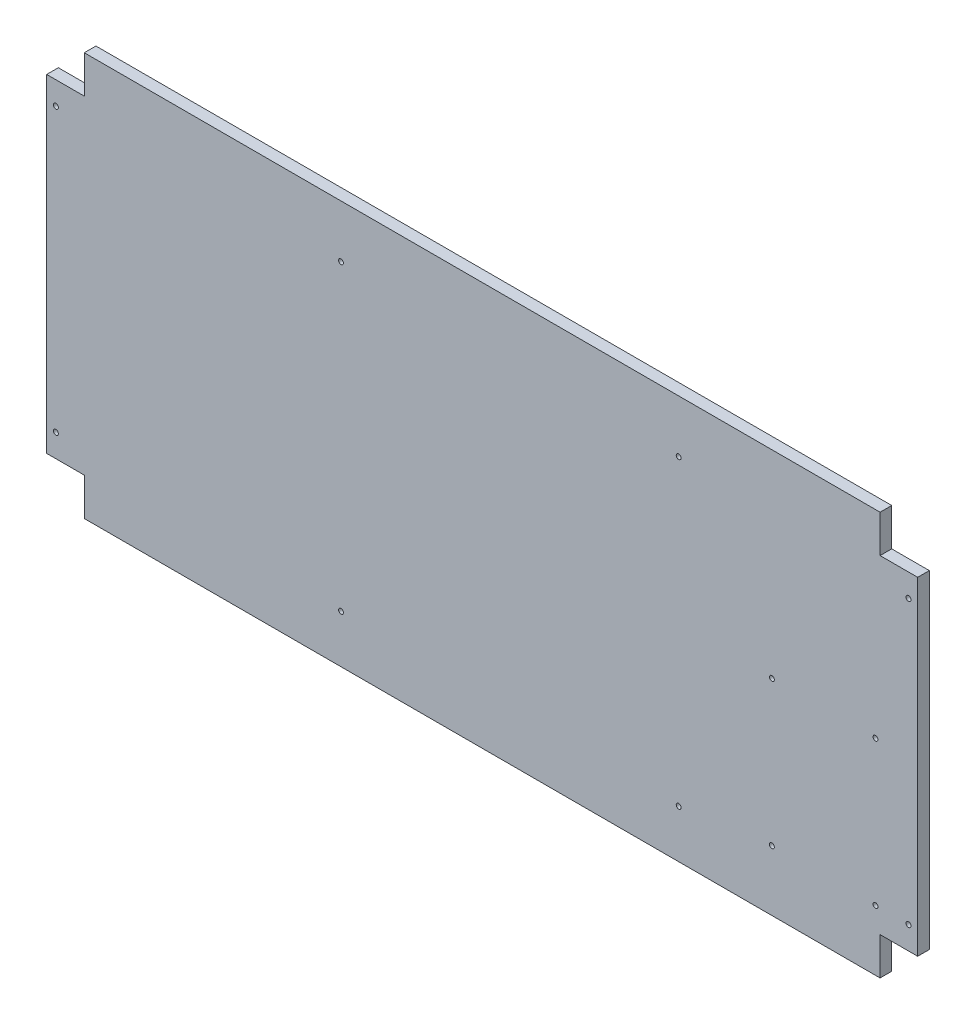
ISO-10303-21;
HEADER;
FILE_DESCRIPTION(('STEP AP214'),'2;1');
FILE_NAME('part.step','',(''),(''),'','','');
FILE_SCHEMA(('AUTOMOTIVE_DESIGN { 1 0 10303 214 1 1 1 1 }'));
ENDSEC;
DATA;
#1=APPLICATION_CONTEXT('core data for automotive mechanical design processes');
#2=APPLICATION_PROTOCOL_DEFINITION('international standard','automotive_design',2000,#1);
#3=PRODUCT_CONTEXT('',#1,'mechanical');
#4=PRODUCT('Part','Part','',(#3));
#5=PRODUCT_RELATED_PRODUCT_CATEGORY('part','',(#4));
#6=PRODUCT_DEFINITION_FORMATION('','',#4);
#7=PRODUCT_DEFINITION_CONTEXT('part definition',#1,'design');
#8=PRODUCT_DEFINITION('design','',#6,#7);
#9=PRODUCT_DEFINITION_SHAPE('','',#8);
#10=(LENGTH_UNIT() NAMED_UNIT(*) SI_UNIT(.MILLI.,.METRE.));
#11=(NAMED_UNIT(*) PLANE_ANGLE_UNIT() SI_UNIT($,.RADIAN.));
#12=(NAMED_UNIT(*) SI_UNIT($,.STERADIAN.) SOLID_ANGLE_UNIT());
#13=UNCERTAINTY_MEASURE_WITH_UNIT(LENGTH_MEASURE(1.E-05),#10,'distance_accuracy_value','');
#14=(GEOMETRIC_REPRESENTATION_CONTEXT(3) GLOBAL_UNCERTAINTY_ASSIGNED_CONTEXT((#13)) GLOBAL_UNIT_ASSIGNED_CONTEXT((#10,
#11,#12)) REPRESENTATION_CONTEXT('',''));
#15=CARTESIAN_POINT('',(0.,0.,0.));
#16=DIRECTION('',(0.,0.,1.));
#17=DIRECTION('',(1.,0.,0.));
#18=AXIS2_PLACEMENT_3D('',#15,#16,#17);
#19=CARTESIAN_POINT('',(475.,-220.,12.7));
#20=DIRECTION('',(-1.,0.,0.));
#21=DIRECTION('',(0.,0.,1.));
#22=AXIS2_PLACEMENT_3D('',#19,#20,#21);
#23=PLANE('',#22);
#24=DIRECTION('',(0.,1.,0.));
#25=VECTOR('',#24,1.);
#26=CARTESIAN_POINT('',(475.,-220.,12.7));
#27=LINE('',#26,#25);
#28=CARTESIAN_POINT('',(475.,-179.,12.7));
#29=VERTEX_POINT('',#28);
#30=CARTESIAN_POINT('',(475.,179.,12.7));
#31=VERTEX_POINT('',#30);
#32=EDGE_CURVE('E167',#29,#31,#27,.T.);
#33=ORIENTED_EDGE('',*,*,#32,.F.);
#34=DIRECTION('',(0.,0.,1.));
#35=VECTOR('',#34,1.);
#36=CARTESIAN_POINT('',(475.,-179.,-0.000999999999999265));
#37=LINE('',#36,#35);
#38=CARTESIAN_POINT('',(475.,-179.,0.));
#39=VERTEX_POINT('',#38);
#40=EDGE_CURVE('E150',#39,#29,#37,.T.);
#41=ORIENTED_EDGE('',*,*,#40,.F.);
#42=DIRECTION('',(0.,1.,0.));
#43=VECTOR('',#42,1.);
#44=CARTESIAN_POINT('',(475.,-220.,0.));
#45=LINE('',#44,#43);
#46=CARTESIAN_POINT('',(475.,179.,0.));
#47=VERTEX_POINT('',#46);
#48=EDGE_CURVE('E144',#39,#47,#45,.T.);
#49=ORIENTED_EDGE('',*,*,#48,.T.);
#50=DIRECTION('',(0.,0.,1.));
#51=VECTOR('',#50,1.);
#52=CARTESIAN_POINT('',(475.,179.,-0.000999999999999265));
#53=LINE('',#52,#51);
#54=EDGE_CURVE('E125',#47,#31,#53,.T.);
#55=ORIENTED_EDGE('',*,*,#54,.T.);
#56=EDGE_LOOP('',(#33,#41,#49,#55));
#57=FACE_BOUND('',#56,.T.);
#58=ADVANCED_FACE('F35',(#57),#23,.F.);
#59=CARTESIAN_POINT('',(-475.,220.,12.7));
#60=DIRECTION('',(0.,-1.,0.));
#61=DIRECTION('',(0.,0.,-1.));
#62=AXIS2_PLACEMENT_3D('',#59,#60,#61);
#63=PLANE('',#62);
#64=DIRECTION('',(-1.,0.,0.));
#65=VECTOR('',#64,1.);
#66=CARTESIAN_POINT('',(-475.,220.,12.7));
#67=LINE('',#66,#65);
#68=CARTESIAN_POINT('',(434.,220.,12.7));
#69=VERTEX_POINT('',#68);
#70=CARTESIAN_POINT('',(-434.,220.,12.7));
#71=VERTEX_POINT('',#70);
#72=EDGE_CURVE('E172',#69,#71,#67,.T.);
#73=ORIENTED_EDGE('',*,*,#72,.F.);
#74=DIRECTION('',(0.,0.,1.));
#75=VECTOR('',#74,1.);
#76=CARTESIAN_POINT('',(434.,220.,-0.000999999999999265));
#77=LINE('',#76,#75);
#78=CARTESIAN_POINT('',(434.,220.,0.));
#79=VERTEX_POINT('',#78);
#80=EDGE_CURVE('E232',#79,#69,#77,.T.);
#81=ORIENTED_EDGE('',*,*,#80,.F.);
#82=DIRECTION('',(-1.,0.,0.));
#83=VECTOR('',#82,1.);
#84=CARTESIAN_POINT('',(-475.,220.,0.));
#85=LINE('',#84,#83);
#86=CARTESIAN_POINT('',(-434.,220.,0.));
#87=VERTEX_POINT('',#86);
#88=EDGE_CURVE('E151',#79,#87,#85,.T.);
#89=ORIENTED_EDGE('',*,*,#88,.T.);
#90=DIRECTION('',(0.,0.,1.));
#91=VECTOR('',#90,1.);
#92=CARTESIAN_POINT('',(-434.,220.,-0.000999999999999265));
#93=LINE('',#92,#91);
#94=EDGE_CURVE('E158',#87,#71,#93,.T.);
#95=ORIENTED_EDGE('',*,*,#94,.T.);
#96=EDGE_LOOP('',(#73,#81,#89,#95));
#97=FACE_BOUND('',#96,.T.);
#98=ADVANCED_FACE('F355',(#97),#63,.F.);
#99=CARTESIAN_POINT('',(-475.,-220.,12.7));
#100=DIRECTION('',(1.,0.,0.));
#101=DIRECTION('',(0.,0.,-1.));
#102=AXIS2_PLACEMENT_3D('',#99,#100,#101);
#103=PLANE('',#102);
#104=DIRECTION('',(0.,-1.,0.));
#105=VECTOR('',#104,1.);
#106=CARTESIAN_POINT('',(-475.,-220.,0.));
#107=LINE('',#106,#105);
#108=CARTESIAN_POINT('',(-475.,179.,0.));
#109=VERTEX_POINT('',#108);
#110=CARTESIAN_POINT('',(-475.,-179.,0.));
#111=VERTEX_POINT('',#110);
#112=EDGE_CURVE('E155',#109,#111,#107,.T.);
#113=ORIENTED_EDGE('',*,*,#112,.T.);
#114=DIRECTION('',(0.,0.,1.));
#115=VECTOR('',#114,1.);
#116=CARTESIAN_POINT('',(-475.,-179.,-0.000999999999999265));
#117=LINE('',#116,#115);
#118=CARTESIAN_POINT('',(-475.,-179.,12.7));
#119=VERTEX_POINT('',#118);
#120=EDGE_CURVE('E191',#111,#119,#117,.T.);
#121=ORIENTED_EDGE('',*,*,#120,.T.);
#122=DIRECTION('',(0.,-1.,0.));
#123=VECTOR('',#122,1.);
#124=CARTESIAN_POINT('',(-475.,-220.,12.7));
#125=LINE('',#124,#123);
#126=CARTESIAN_POINT('',(-475.,179.,12.7));
#127=VERTEX_POINT('',#126);
#128=EDGE_CURVE('E43',#127,#119,#125,.T.);
#129=ORIENTED_EDGE('',*,*,#128,.F.);
#130=DIRECTION('',(0.,0.,1.));
#131=VECTOR('',#130,1.);
#132=CARTESIAN_POINT('',(-475.,179.,-0.000999999999999265));
#133=LINE('',#132,#131);
#134=EDGE_CURVE('E190',#109,#127,#133,.T.);
#135=ORIENTED_EDGE('',*,*,#134,.F.);
#136=EDGE_LOOP('',(#113,#121,#129,#135));
#137=FACE_BOUND('',#136,.T.);
#138=ADVANCED_FACE('F189',(#137),#103,.F.);
#139=CARTESIAN_POINT('',(-475.,-220.,12.7));
#140=DIRECTION('',(0.,1.,0.));
#141=DIRECTION('',(0.,0.,1.));
#142=AXIS2_PLACEMENT_3D('',#139,#140,#141);
#143=PLANE('',#142);
#144=DIRECTION('',(1.,0.,0.));
#145=VECTOR('',#144,1.);
#146=CARTESIAN_POINT('',(-475.,-220.,12.7));
#147=LINE('',#146,#145);
#148=CARTESIAN_POINT('',(-434.,-220.,12.7));
#149=VERTEX_POINT('',#148);
#150=CARTESIAN_POINT('',(434.,-220.,12.7));
#151=VERTEX_POINT('',#150);
#152=EDGE_CURVE('E11',#149,#151,#147,.T.);
#153=ORIENTED_EDGE('',*,*,#152,.F.);
#154=DIRECTION('',(0.,0.,1.));
#155=VECTOR('',#154,1.);
#156=CARTESIAN_POINT('',(-434.,-220.,-0.000999999999999265));
#157=LINE('',#156,#155);
#158=CARTESIAN_POINT('',(-434.,-220.,0.));
#159=VERTEX_POINT('',#158);
#160=EDGE_CURVE('E198',#159,#149,#157,.T.);
#161=ORIENTED_EDGE('',*,*,#160,.F.);
#162=DIRECTION('',(1.,0.,0.));
#163=VECTOR('',#162,1.);
#164=CARTESIAN_POINT('',(-475.,-220.,0.));
#165=LINE('',#164,#163);
#166=CARTESIAN_POINT('',(434.,-220.,0.));
#167=VERTEX_POINT('',#166);
#168=EDGE_CURVE('E38',#159,#167,#165,.T.);
#169=ORIENTED_EDGE('',*,*,#168,.T.);
#170=DIRECTION('',(0.,0.,1.));
#171=VECTOR('',#170,1.);
#172=CARTESIAN_POINT('',(434.,-220.,-0.000999999999999265));
#173=LINE('',#172,#171);
#174=EDGE_CURVE('E225',#167,#151,#173,.T.);
#175=ORIENTED_EDGE('',*,*,#174,.T.);
#176=EDGE_LOOP('',(#153,#161,#169,#175));
#177=FACE_BOUND('',#176,.T.);
#178=ADVANCED_FACE('F315',(#177),#143,.F.);
#179=CARTESIAN_POINT('',(0.,0.,12.7));
#180=DIRECTION('',(0.,0.,-1.));
#181=DIRECTION('',(-1.,0.,0.));
#182=AXIS2_PLACEMENT_3D('',#179,#180,#181);
#183=PLANE('',#182);
#184=CARTESIAN_POINT('',(429.,-154.,12.7));
#185=DIRECTION('',(0.,0.,1.));
#186=DIRECTION('',(1.,0.,0.));
#187=AXIS2_PLACEMENT_3D('',#184,#185,#186);
#188=CIRCLE('',#187,2.66500000000002);
#189=CARTESIAN_POINT('',(431.665,-154.,12.7));
#190=VERTEX_POINT('',#189);
#191=EDGE_CURVE('E290',#190,#190,#188,.T.);
#192=ORIENTED_EDGE('',*,*,#191,.F.);
#193=EDGE_LOOP('',(#192));
#194=FACE_BOUND('',#193,.T.);
#195=CARTESIAN_POINT('',(316.,3.9999999999998,12.7));
#196=DIRECTION('',(0.,0.,1.));
#197=DIRECTION('',(1.,0.,0.));
#198=AXIS2_PLACEMENT_3D('',#195,#196,#197);
#199=CIRCLE('',#198,2.66500000000002);
#200=CARTESIAN_POINT('',(318.665,3.9999999999998,12.7));
#201=VERTEX_POINT('',#200);
#202=EDGE_CURVE('E296',#201,#201,#199,.T.);
#203=ORIENTED_EDGE('',*,*,#202,.F.);
#204=EDGE_LOOP('',(#203));
#205=FACE_BOUND('',#204,.T.);
#206=CARTESIAN_POINT('',(316.,-154.,12.7));
#207=DIRECTION('',(0.,0.,1.));
#208=DIRECTION('',(1.,0.,0.));
#209=AXIS2_PLACEMENT_3D('',#206,#207,#208);
#210=CIRCLE('',#209,2.66499999999996);
#211=CARTESIAN_POINT('',(318.665,-154.,12.7));
#212=VERTEX_POINT('',#211);
#213=EDGE_CURVE('E297',#212,#212,#210,.T.);
#214=ORIENTED_EDGE('',*,*,#213,.F.);
#215=EDGE_LOOP('',(#214));
#216=FACE_BOUND('',#215,.T.);
#217=CARTESIAN_POINT('',(429.,3.9999999999998,12.7));
#218=DIRECTION('',(0.,0.,1.));
#219=DIRECTION('',(1.,0.,0.));
#220=AXIS2_PLACEMENT_3D('',#217,#218,#219);
#221=CIRCLE('',#220,2.66500000000002);
#222=CARTESIAN_POINT('',(431.665,3.9999999999998,12.7));
#223=VERTEX_POINT('',#222);
#224=EDGE_CURVE('E273',#223,#223,#221,.T.);
#225=ORIENTED_EDGE('',*,*,#224,.F.);
#226=EDGE_LOOP('',(#225));
#227=FACE_BOUND('',#226,.T.);
#228=CARTESIAN_POINT('',(-153.985226099245,162.594940384192,12.7));
#229=DIRECTION('',(0.,0.,1.));
#230=DIRECTION('',(1.,0.,0.));
#231=AXIS2_PLACEMENT_3D('',#228,#229,#230);
#232=CIRCLE('',#231,2.66499999999999);
#233=CARTESIAN_POINT('',(-151.320226099245,162.594940384192,12.7));
#234=VERTEX_POINT('',#233);
#235=EDGE_CURVE('E272',#234,#234,#232,.T.);
#236=ORIENTED_EDGE('',*,*,#235,.F.);
#237=EDGE_LOOP('',(#236));
#238=FACE_BOUND('',#237,.T.);
#239=CARTESIAN_POINT('',(214.314773900755,162.594940384192,12.7));
#240=DIRECTION('',(0.,0.,1.));
#241=DIRECTION('',(1.,0.,0.));
#242=AXIS2_PLACEMENT_3D('',#239,#240,#241);
#243=CIRCLE('',#242,2.66499999999999);
#244=CARTESIAN_POINT('',(216.979773900755,162.594940384192,12.7));
#245=VERTEX_POINT('',#244);
#246=EDGE_CURVE('E279',#245,#245,#243,.T.);
#247=ORIENTED_EDGE('',*,*,#246,.F.);
#248=EDGE_LOOP('',(#247));
#249=FACE_BOUND('',#248,.T.);
#250=CARTESIAN_POINT('',(214.314773900755,-167.605059615808,12.7));
#251=DIRECTION('',(0.,0.,1.));
#252=DIRECTION('',(1.,0.,0.));
#253=AXIS2_PLACEMENT_3D('',#250,#251,#252);
#254=CIRCLE('',#253,2.66499999999999);
#255=CARTESIAN_POINT('',(216.979773900755,-167.605059615808,12.7));
#256=VERTEX_POINT('',#255);
#257=EDGE_CURVE('E266',#256,#256,#254,.T.);
#258=ORIENTED_EDGE('',*,*,#257,.F.);
#259=EDGE_LOOP('',(#258));
#260=FACE_BOUND('',#259,.T.);
#261=CARTESIAN_POINT('',(-153.985226099245,-167.605059615808,12.7));
#262=DIRECTION('',(0.,0.,1.));
#263=DIRECTION('',(1.,0.,0.));
#264=AXIS2_PLACEMENT_3D('',#261,#262,#263);
#265=CIRCLE('',#264,2.66499999999999);
#266=CARTESIAN_POINT('',(-151.320226099245,-167.605059615808,12.7));
#267=VERTEX_POINT('',#266);
#268=EDGE_CURVE('E260',#267,#267,#265,.T.);
#269=ORIENTED_EDGE('',*,*,#268,.F.);
#270=EDGE_LOOP('',(#269));
#271=FACE_BOUND('',#270,.T.);
#272=CARTESIAN_POINT('',(-465.,154.,12.7));
#273=DIRECTION('',(0.,0.,1.));
#274=DIRECTION('',(-1.,0.,0.));
#275=AXIS2_PLACEMENT_3D('',#272,#273,#274);
#276=CIRCLE('',#275,2.74999999999998);
#277=CARTESIAN_POINT('',(-467.75,154.,12.7));
#278=VERTEX_POINT('',#277);
#279=EDGE_CURVE('E242',#278,#278,#276,.T.);
#280=ORIENTED_EDGE('',*,*,#279,.F.);
#281=EDGE_LOOP('',(#280));
#282=FACE_BOUND('',#281,.T.);
#283=CARTESIAN_POINT('',(465.,-154.,12.7));
#284=DIRECTION('',(0.,0.,1.));
#285=DIRECTION('',(-1.,0.,0.));
#286=AXIS2_PLACEMENT_3D('',#283,#284,#285);
#287=CIRCLE('',#286,2.74999999999998);
#288=CARTESIAN_POINT('',(462.25,-154.,12.7));
#289=VERTEX_POINT('',#288);
#290=EDGE_CURVE('E248',#289,#289,#287,.T.);
#291=ORIENTED_EDGE('',*,*,#290,.F.);
#292=EDGE_LOOP('',(#291));
#293=FACE_BOUND('',#292,.T.);
#294=CARTESIAN_POINT('',(465.,154.,12.7));
#295=DIRECTION('',(0.,0.,1.));
#296=DIRECTION('',(1.,0.,0.));
#297=AXIS2_PLACEMENT_3D('',#294,#295,#296);
#298=CIRCLE('',#297,2.74999999999998);
#299=CARTESIAN_POINT('',(467.75,154.,12.7));
#300=VERTEX_POINT('',#299);
#301=EDGE_CURVE('E249',#300,#300,#298,.T.);
#302=ORIENTED_EDGE('',*,*,#301,.F.);
#303=EDGE_LOOP('',(#302));
#304=FACE_BOUND('',#303,.T.);
#305=CARTESIAN_POINT('',(-465.,-154.,12.7));
#306=DIRECTION('',(0.,0.,1.));
#307=DIRECTION('',(1.,0.,0.));
#308=AXIS2_PLACEMENT_3D('',#305,#306,#307);
#309=CIRCLE('',#308,2.74999999999998);
#310=CARTESIAN_POINT('',(-462.25,-154.,12.7));
#311=VERTEX_POINT('',#310);
#312=EDGE_CURVE('E220',#311,#311,#309,.T.);
#313=ORIENTED_EDGE('',*,*,#312,.F.);
#314=EDGE_LOOP('',(#313));
#315=FACE_BOUND('',#314,.T.);
#316=ORIENTED_EDGE('',*,*,#128,.T.);
#317=DIRECTION('',(-1.,0.,0.));
#318=VECTOR('',#317,1.);
#319=CARTESIAN_POINT('',(-475.,-179.,12.7));
#320=LINE('',#319,#318);
#321=CARTESIAN_POINT('',(-434.,-179.,12.7));
#322=VERTEX_POINT('',#321);
#323=EDGE_CURVE('E185',#322,#119,#320,.T.);
#324=ORIENTED_EDGE('',*,*,#323,.F.);
#325=DIRECTION('',(0.,1.,0.));
#326=VECTOR('',#325,1.);
#327=CARTESIAN_POINT('',(-434.,-220.,12.7));
#328=LINE('',#327,#326);
#329=EDGE_CURVE('E218',#149,#322,#328,.T.);
#330=ORIENTED_EDGE('',*,*,#329,.F.);
#331=ORIENTED_EDGE('',*,*,#152,.T.);
#332=DIRECTION('',(0.,-1.,0.));
#333=VECTOR('',#332,1.);
#334=CARTESIAN_POINT('',(434.,-220.,12.7));
#335=LINE('',#334,#333);
#336=CARTESIAN_POINT('',(434.,-179.,12.7));
#337=VERTEX_POINT('',#336);
#338=EDGE_CURVE('E227',#337,#151,#335,.T.);
#339=ORIENTED_EDGE('',*,*,#338,.F.);
#340=DIRECTION('',(-1.,0.,0.));
#341=VECTOR('',#340,1.);
#342=CARTESIAN_POINT('',(475.,-179.,12.7));
#343=LINE('',#342,#341);
#344=EDGE_CURVE('E196',#29,#337,#343,.T.);
#345=ORIENTED_EDGE('',*,*,#344,.F.);
#346=ORIENTED_EDGE('',*,*,#32,.T.);
#347=DIRECTION('',(1.,0.,0.));
#348=VECTOR('',#347,1.);
#349=CARTESIAN_POINT('',(475.,179.,12.7));
#350=LINE('',#349,#348);
#351=CARTESIAN_POINT('',(434.,179.,12.7));
#352=VERTEX_POINT('',#351);
#353=EDGE_CURVE('E131',#352,#31,#350,.T.);
#354=ORIENTED_EDGE('',*,*,#353,.F.);
#355=DIRECTION('',(0.,-1.,0.));
#356=VECTOR('',#355,1.);
#357=CARTESIAN_POINT('',(434.,220.,12.7));
#358=LINE('',#357,#356);
#359=EDGE_CURVE('E147',#69,#352,#358,.T.);
#360=ORIENTED_EDGE('',*,*,#359,.F.);
#361=ORIENTED_EDGE('',*,*,#72,.T.);
#362=DIRECTION('',(0.,1.,0.));
#363=VECTOR('',#362,1.);
#364=CARTESIAN_POINT('',(-434.,220.,12.7));
#365=LINE('',#364,#363);
#366=CARTESIAN_POINT('',(-434.,179.,12.7));
#367=VERTEX_POINT('',#366);
#368=EDGE_CURVE('E207',#367,#71,#365,.T.);
#369=ORIENTED_EDGE('',*,*,#368,.F.);
#370=DIRECTION('',(1.,0.,0.));
#371=VECTOR('',#370,1.);
#372=CARTESIAN_POINT('',(-475.,179.,12.7));
#373=LINE('',#372,#371);
#374=EDGE_CURVE('E188',#127,#367,#373,.T.);
#375=ORIENTED_EDGE('',*,*,#374,.F.);
#376=EDGE_LOOP('',(#316,#324,#330,#331,#339,#345,#346,#354,#360,#361,#369,#375));
#377=FACE_BOUND('',#376,.T.);
#378=ADVANCED_FACE('F183',(#194,#205,#216,#227,#238,#249,#260,#271,#282,#293,#304,#315,#377),
#183,.F.);
#379=CARTESIAN_POINT('',(0.,0.,0.));
#380=DIRECTION('',(0.,0.,-1.));
#381=DIRECTION('',(-1.,0.,0.));
#382=AXIS2_PLACEMENT_3D('',#379,#380,#381);
#383=PLANE('',#382);
#384=CARTESIAN_POINT('',(429.,-154.,0.));
#385=DIRECTION('',(0.,0.,-1.));
#386=DIRECTION('',(-1.,0.,0.));
#387=AXIS2_PLACEMENT_3D('',#384,#385,#386);
#388=CIRCLE('',#387,2.66500000000002);
#389=CARTESIAN_POINT('',(426.335,-154.,0.));
#390=VERTEX_POINT('',#389);
#391=EDGE_CURVE('E300',#390,#390,#388,.F.);
#392=ORIENTED_EDGE('',*,*,#391,.T.);
#393=EDGE_LOOP('',(#392));
#394=FACE_BOUND('',#393,.T.);
#395=CARTESIAN_POINT('',(316.,3.9999999999998,0.));
#396=DIRECTION('',(0.,0.,-1.));
#397=DIRECTION('',(-1.,0.,0.));
#398=AXIS2_PLACEMENT_3D('',#395,#396,#397);
#399=CIRCLE('',#398,2.66500000000002);
#400=CARTESIAN_POINT('',(313.335,3.9999999999998,0.));
#401=VERTEX_POINT('',#400);
#402=EDGE_CURVE('E293',#401,#401,#399,.F.);
#403=ORIENTED_EDGE('',*,*,#402,.T.);
#404=EDGE_LOOP('',(#403));
#405=FACE_BOUND('',#404,.T.);
#406=CARTESIAN_POINT('',(316.,-154.,0.));
#407=DIRECTION('',(0.,0.,-1.));
#408=DIRECTION('',(-1.,0.,0.));
#409=AXIS2_PLACEMENT_3D('',#406,#407,#408);
#410=CIRCLE('',#409,2.66499999999996);
#411=CARTESIAN_POINT('',(313.335,-154.,0.));
#412=VERTEX_POINT('',#411);
#413=EDGE_CURVE('E305',#412,#412,#410,.F.);
#414=ORIENTED_EDGE('',*,*,#413,.T.);
#415=EDGE_LOOP('',(#414));
#416=FACE_BOUND('',#415,.T.);
#417=CARTESIAN_POINT('',(429.,3.9999999999998,0.));
#418=DIRECTION('',(0.,0.,-1.));
#419=DIRECTION('',(-1.,0.,0.));
#420=AXIS2_PLACEMENT_3D('',#417,#418,#419);
#421=CIRCLE('',#420,2.66500000000002);
#422=CARTESIAN_POINT('',(426.335,3.9999999999998,0.));
#423=VERTEX_POINT('',#422);
#424=EDGE_CURVE('E287',#423,#423,#421,.F.);
#425=ORIENTED_EDGE('',*,*,#424,.T.);
#426=EDGE_LOOP('',(#425));
#427=FACE_BOUND('',#426,.T.);
#428=CARTESIAN_POINT('',(-153.985226099245,162.594940384192,0.));
#429=DIRECTION('',(0.,0.,-1.));
#430=DIRECTION('',(-1.,0.,0.));
#431=AXIS2_PLACEMENT_3D('',#428,#429,#430);
#432=CIRCLE('',#431,2.66499999999999);
#433=CARTESIAN_POINT('',(-156.650226099245,162.594940384192,0.));
#434=VERTEX_POINT('',#433);
#435=EDGE_CURVE('E269',#434,#434,#432,.F.);
#436=ORIENTED_EDGE('',*,*,#435,.T.);
#437=EDGE_LOOP('',(#436));
#438=FACE_BOUND('',#437,.T.);
#439=CARTESIAN_POINT('',(214.314773900755,162.594940384192,0.));
#440=DIRECTION('',(0.,0.,-1.));
#441=DIRECTION('',(-1.,0.,0.));
#442=AXIS2_PLACEMENT_3D('',#439,#440,#441);
#443=CIRCLE('',#442,2.66499999999999);
#444=CARTESIAN_POINT('',(211.649773900755,162.594940384192,0.));
#445=VERTEX_POINT('',#444);
#446=EDGE_CURVE('E276',#445,#445,#443,.F.);
#447=ORIENTED_EDGE('',*,*,#446,.T.);
#448=EDGE_LOOP('',(#447));
#449=FACE_BOUND('',#448,.T.);
#450=CARTESIAN_POINT('',(214.314773900755,-167.605059615808,0.));
#451=DIRECTION('',(0.,0.,-1.));
#452=DIRECTION('',(-1.,0.,0.));
#453=AXIS2_PLACEMENT_3D('',#450,#451,#452);
#454=CIRCLE('',#453,2.66499999999999);
#455=CARTESIAN_POINT('',(211.649773900755,-167.605059615808,0.));
#456=VERTEX_POINT('',#455);
#457=EDGE_CURVE('E282',#456,#456,#454,.F.);
#458=ORIENTED_EDGE('',*,*,#457,.T.);
#459=EDGE_LOOP('',(#458));
#460=FACE_BOUND('',#459,.T.);
#461=CARTESIAN_POINT('',(-153.985226099245,-167.605059615808,0.));
#462=DIRECTION('',(0.,0.,-1.));
#463=DIRECTION('',(-1.,0.,0.));
#464=AXIS2_PLACEMENT_3D('',#461,#462,#463);
#465=CIRCLE('',#464,2.66499999999999);
#466=CARTESIAN_POINT('',(-156.650226099245,-167.605059615808,0.));
#467=VERTEX_POINT('',#466);
#468=EDGE_CURVE('E263',#467,#467,#465,.F.);
#469=ORIENTED_EDGE('',*,*,#468,.T.);
#470=EDGE_LOOP('',(#469));
#471=FACE_BOUND('',#470,.T.);
#472=CARTESIAN_POINT('',(-465.,154.,0.));
#473=DIRECTION('',(0.,0.,-1.));
#474=DIRECTION('',(-1.,0.,0.));
#475=AXIS2_PLACEMENT_3D('',#472,#473,#474);
#476=CIRCLE('',#475,2.74999999999998);
#477=CARTESIAN_POINT('',(-467.75,154.,0.));
#478=VERTEX_POINT('',#477);
#479=EDGE_CURVE('E252',#478,#478,#476,.F.);
#480=ORIENTED_EDGE('',*,*,#479,.T.);
#481=EDGE_LOOP('',(#480));
#482=FACE_BOUND('',#481,.T.);
#483=CARTESIAN_POINT('',(465.,-154.,0.));
#484=DIRECTION('',(0.,0.,-1.));
#485=DIRECTION('',(-1.,0.,0.));
#486=AXIS2_PLACEMENT_3D('',#483,#484,#485);
#487=CIRCLE('',#486,2.74999999999998);
#488=CARTESIAN_POINT('',(462.25,-154.,0.));
#489=VERTEX_POINT('',#488);
#490=EDGE_CURVE('E245',#489,#489,#487,.F.);
#491=ORIENTED_EDGE('',*,*,#490,.T.);
#492=EDGE_LOOP('',(#491));
#493=FACE_BOUND('',#492,.T.);
#494=CARTESIAN_POINT('',(465.,154.,0.));
#495=DIRECTION('',(0.,0.,-1.));
#496=DIRECTION('',(-1.,0.,0.));
#497=AXIS2_PLACEMENT_3D('',#494,#495,#496);
#498=CIRCLE('',#497,2.74999999999998);
#499=CARTESIAN_POINT('',(462.25,154.,0.));
#500=VERTEX_POINT('',#499);
#501=EDGE_CURVE('E257',#500,#500,#498,.F.);
#502=ORIENTED_EDGE('',*,*,#501,.T.);
#503=EDGE_LOOP('',(#502));
#504=FACE_BOUND('',#503,.T.);
#505=CARTESIAN_POINT('',(-465.,-154.,0.));
#506=DIRECTION('',(0.,0.,-1.));
#507=DIRECTION('',(-1.,0.,0.));
#508=AXIS2_PLACEMENT_3D('',#505,#506,#507);
#509=CIRCLE('',#508,2.74999999999998);
#510=CARTESIAN_POINT('',(-467.75,-154.,0.));
#511=VERTEX_POINT('',#510);
#512=EDGE_CURVE('E239',#511,#511,#509,.F.);
#513=ORIENTED_EDGE('',*,*,#512,.T.);
#514=EDGE_LOOP('',(#513));
#515=FACE_BOUND('',#514,.T.);
#516=DIRECTION('',(-1.,0.,0.));
#517=VECTOR('',#516,1.);
#518=CARTESIAN_POINT('',(-475.,-179.,0.));
#519=LINE('',#518,#517);
#520=CARTESIAN_POINT('',(-434.,-179.,0.));
#521=VERTEX_POINT('',#520);
#522=EDGE_CURVE('E216',#521,#111,#519,.T.);
#523=ORIENTED_EDGE('',*,*,#522,.T.);
#524=ORIENTED_EDGE('',*,*,#112,.F.);
#525=DIRECTION('',(1.,0.,0.));
#526=VECTOR('',#525,1.);
#527=CARTESIAN_POINT('',(-475.,179.,0.));
#528=LINE('',#527,#526);
#529=CARTESIAN_POINT('',(-434.,179.,0.));
#530=VERTEX_POINT('',#529);
#531=EDGE_CURVE('E152',#109,#530,#528,.T.);
#532=ORIENTED_EDGE('',*,*,#531,.T.);
#533=DIRECTION('',(0.,1.,0.));
#534=VECTOR('',#533,1.);
#535=CARTESIAN_POINT('',(-434.,220.,0.));
#536=LINE('',#535,#534);
#537=EDGE_CURVE('E136',#530,#87,#536,.T.);
#538=ORIENTED_EDGE('',*,*,#537,.T.);
#539=ORIENTED_EDGE('',*,*,#88,.F.);
#540=DIRECTION('',(0.,-1.,0.));
#541=VECTOR('',#540,1.);
#542=CARTESIAN_POINT('',(434.,220.,0.));
#543=LINE('',#542,#541);
#544=CARTESIAN_POINT('',(434.,179.,0.));
#545=VERTEX_POINT('',#544);
#546=EDGE_CURVE('E146',#79,#545,#543,.T.);
#547=ORIENTED_EDGE('',*,*,#546,.T.);
#548=DIRECTION('',(1.,0.,0.));
#549=VECTOR('',#548,1.);
#550=CARTESIAN_POINT('',(475.,179.,0.));
#551=LINE('',#550,#549);
#552=EDGE_CURVE('E128',#545,#47,#551,.T.);
#553=ORIENTED_EDGE('',*,*,#552,.T.);
#554=ORIENTED_EDGE('',*,*,#48,.F.);
#555=DIRECTION('',(-1.,0.,0.));
#556=VECTOR('',#555,1.);
#557=CARTESIAN_POINT('',(475.,-179.,0.));
#558=LINE('',#557,#556);
#559=CARTESIAN_POINT('',(434.,-179.,0.));
#560=VERTEX_POINT('',#559);
#561=EDGE_CURVE('E223',#39,#560,#558,.T.);
#562=ORIENTED_EDGE('',*,*,#561,.T.);
#563=DIRECTION('',(0.,-1.,0.));
#564=VECTOR('',#563,1.);
#565=CARTESIAN_POINT('',(434.,-220.,0.));
#566=LINE('',#565,#564);
#567=EDGE_CURVE('E193',#560,#167,#566,.T.);
#568=ORIENTED_EDGE('',*,*,#567,.T.);
#569=ORIENTED_EDGE('',*,*,#168,.F.);
#570=DIRECTION('',(0.,1.,0.));
#571=VECTOR('',#570,1.);
#572=CARTESIAN_POINT('',(-434.,-220.,0.));
#573=LINE('',#572,#571);
#574=EDGE_CURVE('E217',#159,#521,#573,.T.);
#575=ORIENTED_EDGE('',*,*,#574,.T.);
#576=EDGE_LOOP('',(#523,#524,#532,#538,#539,#547,#553,#554,#562,#568,#569,#575));
#577=FACE_BOUND('',#576,.T.);
#578=ADVANCED_FACE('F142',(#394,#405,#416,#427,#438,#449,#460,#471,#482,#493,#504,#515,#577),
#383,.T.);
#579=CARTESIAN_POINT('',(-434.,220.,-0.000999999999999265));
#580=DIRECTION('',(1.,0.,0.));
#581=DIRECTION('',(0.,1.,0.));
#582=AXIS2_PLACEMENT_3D('',#579,#580,#581);
#583=PLANE('',#582);
#584=DIRECTION('',(0.,0.,1.));
#585=VECTOR('',#584,1.);
#586=CARTESIAN_POINT('',(-434.,179.,-0.000999999999999265));
#587=LINE('',#586,#585);
#588=EDGE_CURVE('E211',#530,#367,#587,.T.);
#589=ORIENTED_EDGE('',*,*,#588,.T.);
#590=ORIENTED_EDGE('',*,*,#368,.T.);
#591=ORIENTED_EDGE('',*,*,#94,.F.);
#592=ORIENTED_EDGE('',*,*,#537,.F.);
#593=EDGE_LOOP('',(#589,#590,#591,#592));
#594=FACE_BOUND('',#593,.T.);
#595=ADVANCED_FACE('F369',(#594),#583,.F.);
#596=CARTESIAN_POINT('',(-475.,179.,-0.000999999999999265));
#597=DIRECTION('',(0.,-1.,0.));
#598=DIRECTION('',(1.,0.,0.));
#599=AXIS2_PLACEMENT_3D('',#596,#597,#598);
#600=PLANE('',#599);
#601=ORIENTED_EDGE('',*,*,#134,.T.);
#602=ORIENTED_EDGE('',*,*,#374,.T.);
#603=ORIENTED_EDGE('',*,*,#588,.F.);
#604=ORIENTED_EDGE('',*,*,#531,.F.);
#605=EDGE_LOOP('',(#601,#602,#603,#604));
#606=FACE_BOUND('',#605,.T.);
#607=ADVANCED_FACE('F213',(#606),#600,.F.);
#608=CARTESIAN_POINT('',(475.,179.,-0.000999999999999265));
#609=DIRECTION('',(0.,-1.,0.));
#610=DIRECTION('',(1.,0.,0.));
#611=AXIS2_PLACEMENT_3D('',#608,#609,#610);
#612=PLANE('',#611);
#613=DIRECTION('',(0.,0.,1.));
#614=VECTOR('',#613,1.);
#615=CARTESIAN_POINT('',(434.,179.,-0.000999999999999265));
#616=LINE('',#615,#614);
#617=EDGE_CURVE('E137',#545,#352,#616,.T.);
#618=ORIENTED_EDGE('',*,*,#617,.T.);
#619=ORIENTED_EDGE('',*,*,#353,.T.);
#620=ORIENTED_EDGE('',*,*,#54,.F.);
#621=ORIENTED_EDGE('',*,*,#552,.F.);
#622=EDGE_LOOP('',(#618,#619,#620,#621));
#623=FACE_BOUND('',#622,.T.);
#624=ADVANCED_FACE('F127',(#623),#612,.F.);
#625=CARTESIAN_POINT('',(434.,220.,-0.000999999999999265));
#626=DIRECTION('',(-1.,0.,0.));
#627=DIRECTION('',(0.,-1.,0.));
#628=AXIS2_PLACEMENT_3D('',#625,#626,#627);
#629=PLANE('',#628);
#630=ORIENTED_EDGE('',*,*,#80,.T.);
#631=ORIENTED_EDGE('',*,*,#359,.T.);
#632=ORIENTED_EDGE('',*,*,#617,.F.);
#633=ORIENTED_EDGE('',*,*,#546,.F.);
#634=EDGE_LOOP('',(#630,#631,#632,#633));
#635=FACE_BOUND('',#634,.T.);
#636=ADVANCED_FACE('F385',(#635),#629,.F.);
#637=CARTESIAN_POINT('',(434.,-220.,-0.000999999999999265));
#638=DIRECTION('',(-1.,0.,0.));
#639=DIRECTION('',(0.,-1.,0.));
#640=AXIS2_PLACEMENT_3D('',#637,#638,#639);
#641=PLANE('',#640);
#642=DIRECTION('',(0.,0.,1.));
#643=VECTOR('',#642,1.);
#644=CARTESIAN_POINT('',(434.,-179.,-0.000999999999999265));
#645=LINE('',#644,#643);
#646=EDGE_CURVE('E59',#560,#337,#645,.T.);
#647=ORIENTED_EDGE('',*,*,#646,.T.);
#648=ORIENTED_EDGE('',*,*,#338,.T.);
#649=ORIENTED_EDGE('',*,*,#174,.F.);
#650=ORIENTED_EDGE('',*,*,#567,.F.);
#651=EDGE_LOOP('',(#647,#648,#649,#650));
#652=FACE_BOUND('',#651,.T.);
#653=ADVANCED_FACE('F382',(#652),#641,.F.);
#654=CARTESIAN_POINT('',(475.,-179.,-0.000999999999999265));
#655=DIRECTION('',(0.,1.,0.));
#656=DIRECTION('',(-1.,0.,0.));
#657=AXIS2_PLACEMENT_3D('',#654,#655,#656);
#658=PLANE('',#657);
#659=ORIENTED_EDGE('',*,*,#40,.T.);
#660=ORIENTED_EDGE('',*,*,#344,.T.);
#661=ORIENTED_EDGE('',*,*,#646,.F.);
#662=ORIENTED_EDGE('',*,*,#561,.F.);
#663=EDGE_LOOP('',(#659,#660,#661,#662));
#664=FACE_BOUND('',#663,.T.);
#665=ADVANCED_FACE('F379',(#664),#658,.F.);
#666=CARTESIAN_POINT('',(-475.,-179.,-0.000999999999999265));
#667=DIRECTION('',(0.,1.,0.));
#668=DIRECTION('',(-1.,0.,0.));
#669=AXIS2_PLACEMENT_3D('',#666,#667,#668);
#670=PLANE('',#669);
#671=DIRECTION('',(0.,0.,1.));
#672=VECTOR('',#671,1.);
#673=CARTESIAN_POINT('',(-434.,-179.,-0.000999999999999265));
#674=LINE('',#673,#672);
#675=EDGE_CURVE('E51',#521,#322,#674,.T.);
#676=ORIENTED_EDGE('',*,*,#675,.T.);
#677=ORIENTED_EDGE('',*,*,#323,.T.);
#678=ORIENTED_EDGE('',*,*,#120,.F.);
#679=ORIENTED_EDGE('',*,*,#522,.F.);
#680=EDGE_LOOP('',(#676,#677,#678,#679));
#681=FACE_BOUND('',#680,.T.);
#682=ADVANCED_FACE('F349',(#681),#670,.F.);
#683=CARTESIAN_POINT('',(-434.,-220.,-0.000999999999999265));
#684=DIRECTION('',(1.,0.,0.));
#685=DIRECTION('',(0.,1.,0.));
#686=AXIS2_PLACEMENT_3D('',#683,#684,#685);
#687=PLANE('',#686);
#688=ORIENTED_EDGE('',*,*,#160,.T.);
#689=ORIENTED_EDGE('',*,*,#329,.T.);
#690=ORIENTED_EDGE('',*,*,#675,.F.);
#691=ORIENTED_EDGE('',*,*,#574,.F.);
#692=EDGE_LOOP('',(#688,#689,#690,#691));
#693=FACE_BOUND('',#692,.T.);
#694=ADVANCED_FACE('F339',(#693),#687,.F.);
#695=CARTESIAN_POINT('',(-465.,-154.,-0.000999999999999265));
#696=DIRECTION('',(0.,0.,1.));
#697=DIRECTION('',(1.,0.,0.));
#698=AXIS2_PLACEMENT_3D('',#695,#696,#697);
#699=CYLINDRICAL_SURFACE('',#698,2.74999999999998);
#700=ORIENTED_EDGE('',*,*,#512,.F.);
#701=EDGE_LOOP('',(#700));
#702=FACE_BOUND('',#701,.T.);
#703=ORIENTED_EDGE('',*,*,#312,.T.);
#704=EDGE_LOOP('',(#703));
#705=FACE_BOUND('',#704,.T.);
#706=ADVANCED_FACE('F336',(#702,#705),#699,.F.);
#707=CARTESIAN_POINT('',(465.,154.,-0.000999999999999265));
#708=DIRECTION('',(0.,0.,1.));
#709=DIRECTION('',(1.,0.,0.));
#710=AXIS2_PLACEMENT_3D('',#707,#708,#709);
#711=CYLINDRICAL_SURFACE('',#710,2.74999999999998);
#712=ORIENTED_EDGE('',*,*,#501,.F.);
#713=EDGE_LOOP('',(#712));
#714=FACE_BOUND('',#713,.T.);
#715=ORIENTED_EDGE('',*,*,#301,.T.);
#716=EDGE_LOOP('',(#715));
#717=FACE_BOUND('',#716,.T.);
#718=ADVANCED_FACE('F338',(#714,#717),#711,.F.);
#719=CARTESIAN_POINT('',(465.,-154.,-0.000999999999999265));
#720=DIRECTION('',(0.,0.,1.));
#721=DIRECTION('',(1.,0.,0.));
#722=AXIS2_PLACEMENT_3D('',#719,#720,#721);
#723=CYLINDRICAL_SURFACE('',#722,2.74999999999998);
#724=ORIENTED_EDGE('',*,*,#490,.F.);
#725=EDGE_LOOP('',(#724));
#726=FACE_BOUND('',#725,.T.);
#727=ORIENTED_EDGE('',*,*,#290,.T.);
#728=EDGE_LOOP('',(#727));
#729=FACE_BOUND('',#728,.T.);
#730=ADVANCED_FACE('F346',(#726,#729),#723,.F.);
#731=CARTESIAN_POINT('',(-465.,154.,-0.000999999999999265));
#732=DIRECTION('',(0.,0.,1.));
#733=DIRECTION('',(1.,0.,0.));
#734=AXIS2_PLACEMENT_3D('',#731,#732,#733);
#735=CYLINDRICAL_SURFACE('',#734,2.74999999999998);
#736=ORIENTED_EDGE('',*,*,#479,.F.);
#737=EDGE_LOOP('',(#736));
#738=FACE_BOUND('',#737,.T.);
#739=ORIENTED_EDGE('',*,*,#279,.T.);
#740=EDGE_LOOP('',(#739));
#741=FACE_BOUND('',#740,.T.);
#742=ADVANCED_FACE('F433',(#738,#741),#735,.F.);
#743=CARTESIAN_POINT('',(-153.985226099245,-167.605059615808,-0.000999999999999265));
#744=DIRECTION('',(0.,0.,1.));
#745=DIRECTION('',(1.,0.,0.));
#746=AXIS2_PLACEMENT_3D('',#743,#744,#745);
#747=CYLINDRICAL_SURFACE('',#746,2.66499999999999);
#748=ORIENTED_EDGE('',*,*,#468,.F.);
#749=EDGE_LOOP('',(#748));
#750=FACE_BOUND('',#749,.T.);
#751=ORIENTED_EDGE('',*,*,#268,.T.);
#752=EDGE_LOOP('',(#751));
#753=FACE_BOUND('',#752,.T.);
#754=ADVANCED_FACE('F442',(#750,#753),#747,.F.);
#755=CARTESIAN_POINT('',(214.314773900755,-167.605059615808,-0.000999999999999265));
#756=DIRECTION('',(0.,0.,1.));
#757=DIRECTION('',(1.,0.,0.));
#758=AXIS2_PLACEMENT_3D('',#755,#756,#757);
#759=CYLINDRICAL_SURFACE('',#758,2.66499999999999);
#760=ORIENTED_EDGE('',*,*,#457,.F.);
#761=EDGE_LOOP('',(#760));
#762=FACE_BOUND('',#761,.T.);
#763=ORIENTED_EDGE('',*,*,#257,.T.);
#764=EDGE_LOOP('',(#763));
#765=FACE_BOUND('',#764,.T.);
#766=ADVANCED_FACE('F452',(#762,#765),#759,.F.);
#767=CARTESIAN_POINT('',(214.314773900755,162.594940384192,-0.000999999999999265));
#768=DIRECTION('',(0.,0.,1.));
#769=DIRECTION('',(1.,0.,0.));
#770=AXIS2_PLACEMENT_3D('',#767,#768,#769);
#771=CYLINDRICAL_SURFACE('',#770,2.66499999999999);
#772=ORIENTED_EDGE('',*,*,#446,.F.);
#773=EDGE_LOOP('',(#772));
#774=FACE_BOUND('',#773,.T.);
#775=ORIENTED_EDGE('',*,*,#246,.T.);
#776=EDGE_LOOP('',(#775));
#777=FACE_BOUND('',#776,.T.);
#778=ADVANCED_FACE('F462',(#774,#777),#771,.F.);
#779=CARTESIAN_POINT('',(-153.985226099245,162.594940384192,-0.000999999999999265));
#780=DIRECTION('',(0.,0.,1.));
#781=DIRECTION('',(1.,0.,0.));
#782=AXIS2_PLACEMENT_3D('',#779,#780,#781);
#783=CYLINDRICAL_SURFACE('',#782,2.66499999999999);
#784=ORIENTED_EDGE('',*,*,#435,.F.);
#785=EDGE_LOOP('',(#784));
#786=FACE_BOUND('',#785,.T.);
#787=ORIENTED_EDGE('',*,*,#235,.T.);
#788=EDGE_LOOP('',(#787));
#789=FACE_BOUND('',#788,.T.);
#790=ADVANCED_FACE('F472',(#786,#789),#783,.F.);
#791=CARTESIAN_POINT('',(429.,3.9999999999998,-0.000999999999999265));
#792=DIRECTION('',(0.,0.,1.));
#793=DIRECTION('',(1.,0.,0.));
#794=AXIS2_PLACEMENT_3D('',#791,#792,#793);
#795=CYLINDRICAL_SURFACE('',#794,2.66500000000002);
#796=ORIENTED_EDGE('',*,*,#424,.F.);
#797=EDGE_LOOP('',(#796));
#798=FACE_BOUND('',#797,.T.);
#799=ORIENTED_EDGE('',*,*,#224,.T.);
#800=EDGE_LOOP('',(#799));
#801=FACE_BOUND('',#800,.T.);
#802=ADVANCED_FACE('F481',(#798,#801),#795,.F.);
#803=CARTESIAN_POINT('',(316.,-154.,-0.000999999999999265));
#804=DIRECTION('',(0.,0.,1.));
#805=DIRECTION('',(1.,0.,0.));
#806=AXIS2_PLACEMENT_3D('',#803,#804,#805);
#807=CYLINDRICAL_SURFACE('',#806,2.66499999999996);
#808=ORIENTED_EDGE('',*,*,#413,.F.);
#809=EDGE_LOOP('',(#808));
#810=FACE_BOUND('',#809,.T.);
#811=ORIENTED_EDGE('',*,*,#213,.T.);
#812=EDGE_LOOP('',(#811));
#813=FACE_BOUND('',#812,.T.);
#814=ADVANCED_FACE('F311',(#810,#813),#807,.F.);
#815=CARTESIAN_POINT('',(316.,3.9999999999998,-0.000999999999999265));
#816=DIRECTION('',(0.,0.,1.));
#817=DIRECTION('',(1.,0.,0.));
#818=AXIS2_PLACEMENT_3D('',#815,#816,#817);
#819=CYLINDRICAL_SURFACE('',#818,2.66500000000002);
#820=ORIENTED_EDGE('',*,*,#402,.F.);
#821=EDGE_LOOP('',(#820));
#822=FACE_BOUND('',#821,.T.);
#823=ORIENTED_EDGE('',*,*,#202,.T.);
#824=EDGE_LOOP('',(#823));
#825=FACE_BOUND('',#824,.T.);
#826=ADVANCED_FACE('F509',(#822,#825),#819,.F.);
#827=CARTESIAN_POINT('',(429.,-154.,-0.000999999999999265));
#828=DIRECTION('',(0.,0.,1.));
#829=DIRECTION('',(1.,0.,0.));
#830=AXIS2_PLACEMENT_3D('',#827,#828,#829);
#831=CYLINDRICAL_SURFACE('',#830,2.66500000000002);
#832=ORIENTED_EDGE('',*,*,#391,.F.);
#833=EDGE_LOOP('',(#832));
#834=FACE_BOUND('',#833,.T.);
#835=ORIENTED_EDGE('',*,*,#191,.T.);
#836=EDGE_LOOP('',(#835));
#837=FACE_BOUND('',#836,.T.);
#838=ADVANCED_FACE('F519',(#834,#837),#831,.F.);
#839=CLOSED_SHELL('',(#58,#98,#138,#178,#378,#578,#595,#607,#624,#636,#653,#665,#682,#694,#706,
#718,#730,#742,#754,#766,#778,#790,#802,#814,#826,#838));
#840=MANIFOLD_SOLID_BREP('B2',#839);
#841=ADVANCED_BREP_SHAPE_REPRESENTATION('',(#18,#840),#14);
#842=SHAPE_DEFINITION_REPRESENTATION(#9,#841);
ENDSEC;
END-ISO-10303-21;
